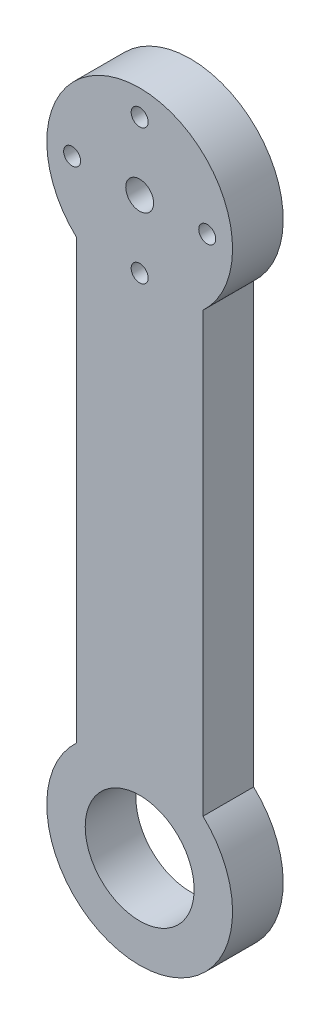
ISO-10303-21;
HEADER;
FILE_DESCRIPTION(('STEP AP214'),'2;1');
FILE_NAME('part.step','',(''),(''),'','','');
FILE_SCHEMA(('AUTOMOTIVE_DESIGN { 1 0 10303 214 1 1 1 1 }'));
ENDSEC;
DATA;
#1=APPLICATION_CONTEXT('core data for automotive mechanical design processes');
#2=APPLICATION_PROTOCOL_DEFINITION('international standard','automotive_design',2000,#1);
#3=PRODUCT_CONTEXT('',#1,'mechanical');
#4=PRODUCT('Part','Part','',(#3));
#5=PRODUCT_RELATED_PRODUCT_CATEGORY('part','',(#4));
#6=PRODUCT_DEFINITION_FORMATION('','',#4);
#7=PRODUCT_DEFINITION_CONTEXT('part definition',#1,'design');
#8=PRODUCT_DEFINITION('design','',#6,#7);
#9=PRODUCT_DEFINITION_SHAPE('','',#8);
#10=(LENGTH_UNIT() NAMED_UNIT(*) SI_UNIT(.MILLI.,.METRE.));
#11=(NAMED_UNIT(*) PLANE_ANGLE_UNIT() SI_UNIT($,.RADIAN.));
#12=(NAMED_UNIT(*) SI_UNIT($,.STERADIAN.) SOLID_ANGLE_UNIT());
#13=UNCERTAINTY_MEASURE_WITH_UNIT(LENGTH_MEASURE(1.E-05),#10,'distance_accuracy_value','');
#14=(GEOMETRIC_REPRESENTATION_CONTEXT(3) GLOBAL_UNCERTAINTY_ASSIGNED_CONTEXT((#13)) GLOBAL_UNIT_ASSIGNED_CONTEXT((#10,
#11,#12)) REPRESENTATION_CONTEXT('',''));
#15=CARTESIAN_POINT('',(0.,0.,0.));
#16=DIRECTION('',(0.,0.,1.));
#17=DIRECTION('',(1.,0.,0.));
#18=AXIS2_PLACEMENT_3D('',#15,#16,#17);
#19=CARTESIAN_POINT('',(7.5,67.5,10.));
#20=DIRECTION('',(0.,0.,-1.));
#21=DIRECTION('',(-1.,0.,0.));
#22=AXIS2_PLACEMENT_3D('',#19,#20,#21);
#23=CYLINDRICAL_SURFACE('',#22,1.005);
#24=CARTESIAN_POINT('',(7.5,67.5,6.));
#25=DIRECTION('',(0.,0.,-1.));
#26=DIRECTION('',(-1.,0.,0.));
#27=AXIS2_PLACEMENT_3D('',#24,#25,#26);
#28=CIRCLE('',#27,1.005);
#29=CARTESIAN_POINT('',(6.495,67.5,6.));
#30=VERTEX_POINT('',#29);
#31=EDGE_CURVE('E160',#30,#30,#28,.T.);
#32=ORIENTED_EDGE('',*,*,#31,.F.);
#33=EDGE_LOOP('',(#32));
#34=FACE_BOUND('',#33,.T.);
#35=CARTESIAN_POINT('',(7.5,67.5,3.));
#36=DIRECTION('',(0.,0.,-1.));
#37=DIRECTION('',(-1.,0.,0.));
#38=AXIS2_PLACEMENT_3D('',#35,#36,#37);
#39=CIRCLE('',#38,1.005);
#40=CARTESIAN_POINT('',(6.495,67.5,3.));
#41=VERTEX_POINT('',#40);
#42=EDGE_CURVE('E39',#41,#41,#39,.F.);
#43=ORIENTED_EDGE('',*,*,#42,.F.);
#44=EDGE_LOOP('',(#43));
#45=FACE_BOUND('',#44,.T.);
#46=ADVANCED_FACE('F35',(#34,#45),#23,.F.);
#47=CARTESIAN_POINT('',(-0.5,75.5,10.));
#48=DIRECTION('',(0.,0.,-1.));
#49=DIRECTION('',(-1.,0.,0.));
#50=AXIS2_PLACEMENT_3D('',#47,#48,#49);
#51=CYLINDRICAL_SURFACE('',#50,1.00499999999999);
#52=CARTESIAN_POINT('',(-0.5,75.5,6.));
#53=DIRECTION('',(0.,0.,-1.));
#54=DIRECTION('',(-1.,0.,0.));
#55=AXIS2_PLACEMENT_3D('',#52,#53,#54);
#56=CIRCLE('',#55,1.00499999999999);
#57=CARTESIAN_POINT('',(-1.50499999999999,75.5,6.));
#58=VERTEX_POINT('',#57);
#59=EDGE_CURVE('E151',#58,#58,#56,.T.);
#60=ORIENTED_EDGE('',*,*,#59,.F.);
#61=EDGE_LOOP('',(#60));
#62=FACE_BOUND('',#61,.T.);
#63=CARTESIAN_POINT('',(-0.5,75.5,3.));
#64=DIRECTION('',(0.,0.,-1.));
#65=DIRECTION('',(-1.,0.,0.));
#66=AXIS2_PLACEMENT_3D('',#63,#64,#65);
#67=CIRCLE('',#66,1.00499999999999);
#68=CARTESIAN_POINT('',(-1.50499999999999,75.5,3.));
#69=VERTEX_POINT('',#68);
#70=EDGE_CURVE('E117',#69,#69,#67,.F.);
#71=ORIENTED_EDGE('',*,*,#70,.F.);
#72=EDGE_LOOP('',(#71));
#73=FACE_BOUND('',#72,.T.);
#74=ADVANCED_FACE('F189',(#62,#73),#51,.F.);
#75=CARTESIAN_POINT('',(7.5,83.5,10.));
#76=DIRECTION('',(0.,0.,-1.));
#77=DIRECTION('',(-1.,0.,0.));
#78=AXIS2_PLACEMENT_3D('',#75,#76,#77);
#79=CYLINDRICAL_SURFACE('',#78,1.00500000000002);
#80=CARTESIAN_POINT('',(7.5,83.5,6.));
#81=DIRECTION('',(0.,0.,-1.));
#82=DIRECTION('',(-1.,0.,0.));
#83=AXIS2_PLACEMENT_3D('',#80,#81,#82);
#84=CIRCLE('',#83,1.00500000000002);
#85=CARTESIAN_POINT('',(6.49499999999998,83.5,6.));
#86=VERTEX_POINT('',#85);
#87=EDGE_CURVE('E154',#86,#86,#84,.T.);
#88=ORIENTED_EDGE('',*,*,#87,.F.);
#89=EDGE_LOOP('',(#88));
#90=FACE_BOUND('',#89,.T.);
#91=CARTESIAN_POINT('',(7.5,83.5,3.));
#92=DIRECTION('',(0.,0.,-1.));
#93=DIRECTION('',(-1.,0.,0.));
#94=AXIS2_PLACEMENT_3D('',#91,#92,#93);
#95=CIRCLE('',#94,1.00500000000002);
#96=CARTESIAN_POINT('',(6.49499999999998,83.5,3.));
#97=VERTEX_POINT('',#96);
#98=EDGE_CURVE('E113',#97,#97,#95,.F.);
#99=ORIENTED_EDGE('',*,*,#98,.F.);
#100=EDGE_LOOP('',(#99));
#101=FACE_BOUND('',#100,.T.);
#102=ADVANCED_FACE('F195',(#90,#101),#79,.F.);
#103=CARTESIAN_POINT('',(15.5,75.5,10.));
#104=DIRECTION('',(0.,0.,-1.));
#105=DIRECTION('',(-1.,0.,0.));
#106=AXIS2_PLACEMENT_3D('',#103,#104,#105);
#107=CYLINDRICAL_SURFACE('',#106,1.005);
#108=CARTESIAN_POINT('',(15.5,75.5,6.));
#109=DIRECTION('',(0.,0.,-1.));
#110=DIRECTION('',(-1.,0.,0.));
#111=AXIS2_PLACEMENT_3D('',#108,#109,#110);
#112=CIRCLE('',#111,1.005);
#113=CARTESIAN_POINT('',(14.495,75.5,6.));
#114=VERTEX_POINT('',#113);
#115=EDGE_CURVE('E157',#114,#114,#112,.T.);
#116=ORIENTED_EDGE('',*,*,#115,.F.);
#117=EDGE_LOOP('',(#116));
#118=FACE_BOUND('',#117,.T.);
#119=CARTESIAN_POINT('',(15.5,75.5,3.));
#120=DIRECTION('',(0.,0.,-1.));
#121=DIRECTION('',(-1.,0.,0.));
#122=AXIS2_PLACEMENT_3D('',#119,#120,#121);
#123=CIRCLE('',#122,1.005);
#124=CARTESIAN_POINT('',(14.495,75.5,3.));
#125=VERTEX_POINT('',#124);
#126=EDGE_CURVE('E108',#125,#125,#123,.F.);
#127=ORIENTED_EDGE('',*,*,#126,.F.);
#128=EDGE_LOOP('',(#127));
#129=FACE_BOUND('',#128,.T.);
#130=ADVANCED_FACE('F202',(#118,#129),#107,.F.);
#131=CARTESIAN_POINT('',(7.5,75.5,10.));
#132=DIRECTION('',(0.,0.,-1.));
#133=DIRECTION('',(-1.,0.,0.));
#134=AXIS2_PLACEMENT_3D('',#131,#132,#133);
#135=CYLINDRICAL_SURFACE('',#134,1.65);
#136=CARTESIAN_POINT('',(7.5,75.5,6.));
#137=DIRECTION('',(0.,0.,-1.));
#138=DIRECTION('',(-1.,0.,0.));
#139=AXIS2_PLACEMENT_3D('',#136,#137,#138);
#140=CIRCLE('',#139,1.65);
#141=CARTESIAN_POINT('',(5.85,75.5,6.));
#142=VERTEX_POINT('',#141);
#143=EDGE_CURVE('E163',#142,#142,#140,.T.);
#144=ORIENTED_EDGE('',*,*,#143,.F.);
#145=EDGE_LOOP('',(#144));
#146=FACE_BOUND('',#145,.T.);
#147=CARTESIAN_POINT('',(7.5,75.5,3.));
#148=DIRECTION('',(0.,0.,-1.));
#149=DIRECTION('',(-1.,0.,0.));
#150=AXIS2_PLACEMENT_3D('',#147,#148,#149);
#151=CIRCLE('',#150,1.65);
#152=CARTESIAN_POINT('',(5.85,75.5,3.));
#153=VERTEX_POINT('',#152);
#154=EDGE_CURVE('E103',#153,#153,#151,.F.);
#155=ORIENTED_EDGE('',*,*,#154,.F.);
#156=EDGE_LOOP('',(#155));
#157=FACE_BOUND('',#156,.T.);
#158=ADVANCED_FACE('F204',(#146,#157),#135,.F.);
#159=CARTESIAN_POINT('',(0.,0.,6.));
#160=DIRECTION('',(1.,0.,0.));
#161=DIRECTION('',(0.,0.,-1.));
#162=AXIS2_PLACEMENT_3D('',#159,#160,#161);
#163=PLANE('',#162);
#164=DIRECTION('',(0.,-1.,0.));
#165=VECTOR('',#164,1.);
#166=CARTESIAN_POINT('',(0.,0.,6.));
#167=LINE('',#166,#165);
#168=CARTESIAN_POINT('',(0.,67.4532615302845,6.));
#169=VERTEX_POINT('',#168);
#170=CARTESIAN_POINT('',(0.,15.5467384697156,6.));
#171=VERTEX_POINT('',#170);
#172=EDGE_CURVE('E44',#169,#171,#167,.T.);
#173=ORIENTED_EDGE('',*,*,#172,.F.);
#174=DIRECTION('',(0.,0.,1.));
#175=VECTOR('',#174,1.);
#176=CARTESIAN_POINT('',(0.,67.4532615302845,0.));
#177=LINE('',#176,#175);
#178=CARTESIAN_POINT('',(0.,67.4532615302845,0.));
#179=VERTEX_POINT('',#178);
#180=EDGE_CURVE('E78',#169,#179,#177,.F.);
#181=ORIENTED_EDGE('',*,*,#180,.T.);
#182=DIRECTION('',(0.,-1.,0.));
#183=VECTOR('',#182,1.);
#184=CARTESIAN_POINT('',(0.,0.,0.));
#185=LINE('',#184,#183);
#186=CARTESIAN_POINT('',(0.,15.5467384697156,0.));
#187=VERTEX_POINT('',#186);
#188=EDGE_CURVE('E89',#179,#187,#185,.T.);
#189=ORIENTED_EDGE('',*,*,#188,.T.);
#190=DIRECTION('',(0.,0.,1.));
#191=VECTOR('',#190,1.);
#192=CARTESIAN_POINT('',(0.,15.5467384697156,0.));
#193=LINE('',#192,#191);
#194=EDGE_CURVE('E96',#187,#171,#193,.T.);
#195=ORIENTED_EDGE('',*,*,#194,.T.);
#196=EDGE_LOOP('',(#173,#181,#189,#195));
#197=FACE_BOUND('',#196,.T.);
#198=ADVANCED_FACE('F37',(#197),#163,.F.);
#199=CARTESIAN_POINT('',(15.,0.,6.));
#200=DIRECTION('',(-1.,0.,0.));
#201=DIRECTION('',(0.,0.,1.));
#202=AXIS2_PLACEMENT_3D('',#199,#200,#201);
#203=PLANE('',#202);
#204=DIRECTION('',(0.,1.,0.));
#205=VECTOR('',#204,1.);
#206=CARTESIAN_POINT('',(15.,0.,0.));
#207=LINE('',#206,#205);
#208=CARTESIAN_POINT('',(15.,15.5467384697156,0.));
#209=VERTEX_POINT('',#208);
#210=CARTESIAN_POINT('',(15.,67.4532615302845,0.));
#211=VERTEX_POINT('',#210);
#212=EDGE_CURVE('E95',#209,#211,#207,.T.);
#213=ORIENTED_EDGE('',*,*,#212,.T.);
#214=DIRECTION('',(0.,0.,1.));
#215=VECTOR('',#214,1.);
#216=CARTESIAN_POINT('',(15.,67.4532615302845,0.));
#217=LINE('',#216,#215);
#218=CARTESIAN_POINT('',(15.,67.4532615302845,6.));
#219=VERTEX_POINT('',#218);
#220=EDGE_CURVE('E80',#211,#219,#217,.T.);
#221=ORIENTED_EDGE('',*,*,#220,.T.);
#222=DIRECTION('',(0.,1.,0.));
#223=VECTOR('',#222,1.);
#224=CARTESIAN_POINT('',(15.,0.,6.));
#225=LINE('',#224,#223);
#226=CARTESIAN_POINT('',(15.,15.5467384697156,6.));
#227=VERTEX_POINT('',#226);
#228=EDGE_CURVE('E11',#227,#219,#225,.T.);
#229=ORIENTED_EDGE('',*,*,#228,.F.);
#230=DIRECTION('',(0.,0.,1.));
#231=VECTOR('',#230,1.);
#232=CARTESIAN_POINT('',(15.,15.5467384697156,0.));
#233=LINE('',#232,#231);
#234=EDGE_CURVE('E99',#227,#209,#233,.F.);
#235=ORIENTED_EDGE('',*,*,#234,.T.);
#236=EDGE_LOOP('',(#213,#221,#229,#235));
#237=FACE_BOUND('',#236,.T.);
#238=ADVANCED_FACE('F173',(#237),#203,.F.);
#239=CARTESIAN_POINT('',(0.,0.,6.));
#240=DIRECTION('',(0.,0.,-1.));
#241=DIRECTION('',(-1.,0.,0.));
#242=AXIS2_PLACEMENT_3D('',#239,#240,#241);
#243=PLANE('',#242);
#244=CARTESIAN_POINT('',(7.5,7.5,6.));
#245=DIRECTION('',(0.,0.,-1.));
#246=DIRECTION('',(-1.,0.,0.));
#247=AXIS2_PLACEMENT_3D('',#244,#245,#246);
#248=CIRCLE('',#247,6.45);
#249=CARTESIAN_POINT('',(1.05,7.5,6.));
#250=VERTEX_POINT('',#249);
#251=EDGE_CURVE('E148',#250,#250,#248,.T.);
#252=ORIENTED_EDGE('',*,*,#251,.T.);
#253=EDGE_LOOP('',(#252));
#254=FACE_BOUND('',#253,.T.);
#255=ORIENTED_EDGE('',*,*,#59,.T.);
#256=EDGE_LOOP('',(#255));
#257=FACE_BOUND('',#256,.T.);
#258=ORIENTED_EDGE('',*,*,#87,.T.);
#259=EDGE_LOOP('',(#258));
#260=FACE_BOUND('',#259,.T.);
#261=ORIENTED_EDGE('',*,*,#115,.T.);
#262=EDGE_LOOP('',(#261));
#263=FACE_BOUND('',#262,.T.);
#264=ORIENTED_EDGE('',*,*,#31,.T.);
#265=EDGE_LOOP('',(#264));
#266=FACE_BOUND('',#265,.T.);
#267=ORIENTED_EDGE('',*,*,#143,.T.);
#268=EDGE_LOOP('',(#267));
#269=FACE_BOUND('',#268,.T.);
#270=CARTESIAN_POINT('',(7.5,75.5,6.));
#271=DIRECTION('',(0.,0.,1.));
#272=DIRECTION('',(1.,0.,0.));
#273=AXIS2_PLACEMENT_3D('',#270,#271,#272);
#274=CIRCLE('',#273,11.);
#275=EDGE_CURVE('E85',#219,#169,#274,.T.);
#276=ORIENTED_EDGE('',*,*,#275,.T.);
#277=ORIENTED_EDGE('',*,*,#172,.T.);
#278=CARTESIAN_POINT('',(7.5,7.5,6.));
#279=DIRECTION('',(0.,0.,1.));
#280=DIRECTION('',(1.,0.,0.));
#281=AXIS2_PLACEMENT_3D('',#278,#279,#280);
#282=CIRCLE('',#281,11.);
#283=EDGE_CURVE('E51',#171,#227,#282,.T.);
#284=ORIENTED_EDGE('',*,*,#283,.T.);
#285=ORIENTED_EDGE('',*,*,#228,.T.);
#286=EDGE_LOOP('',(#276,#277,#284,#285));
#287=FACE_BOUND('',#286,.T.);
#288=ADVANCED_FACE('F184',(#254,#257,#260,#263,#266,#269,#287),#243,.F.);
#289=CARTESIAN_POINT('',(0.,0.,0.));
#290=DIRECTION('',(0.,0.,-1.));
#291=DIRECTION('',(-1.,0.,0.));
#292=AXIS2_PLACEMENT_3D('',#289,#290,#291);
#293=PLANE('',#292);
#294=CARTESIAN_POINT('',(7.5,67.5,0.));
#295=DIRECTION('',(0.,0.,-1.));
#296=DIRECTION('',(-1.,0.,0.));
#297=AXIS2_PLACEMENT_3D('',#294,#295,#296);
#298=CIRCLE('',#297,2.00000000000001);
#299=CARTESIAN_POINT('',(5.49999999999999,67.5,0.));
#300=VERTEX_POINT('',#299);
#301=EDGE_CURVE('E133',#300,#300,#298,.T.);
#302=ORIENTED_EDGE('',*,*,#301,.F.);
#303=EDGE_LOOP('',(#302));
#304=FACE_BOUND('',#303,.T.);
#305=CARTESIAN_POINT('',(-0.5,75.5,0.));
#306=DIRECTION('',(0.,0.,-1.));
#307=DIRECTION('',(-1.,0.,0.));
#308=AXIS2_PLACEMENT_3D('',#305,#306,#307);
#309=CIRCLE('',#308,2.00000000000001);
#310=CARTESIAN_POINT('',(-2.50000000000001,75.5,0.));
#311=VERTEX_POINT('',#310);
#312=EDGE_CURVE('E126',#311,#311,#309,.T.);
#313=ORIENTED_EDGE('',*,*,#312,.F.);
#314=EDGE_LOOP('',(#313));
#315=FACE_BOUND('',#314,.T.);
#316=CARTESIAN_POINT('',(7.5,83.5,0.));
#317=DIRECTION('',(0.,0.,-1.));
#318=DIRECTION('',(-1.,0.,0.));
#319=AXIS2_PLACEMENT_3D('',#316,#317,#318);
#320=CIRCLE('',#319,2.);
#321=CARTESIAN_POINT('',(5.5,83.5,0.));
#322=VERTEX_POINT('',#321);
#323=EDGE_CURVE('E119',#322,#322,#320,.T.);
#324=ORIENTED_EDGE('',*,*,#323,.F.);
#325=EDGE_LOOP('',(#324));
#326=FACE_BOUND('',#325,.T.);
#327=CARTESIAN_POINT('',(15.5,75.5,0.));
#328=DIRECTION('',(0.,0.,-1.));
#329=DIRECTION('',(-1.,0.,0.));
#330=AXIS2_PLACEMENT_3D('',#327,#328,#329);
#331=CIRCLE('',#330,2.);
#332=CARTESIAN_POINT('',(13.5,75.5,0.));
#333=VERTEX_POINT('',#332);
#334=EDGE_CURVE('E115',#333,#333,#331,.T.);
#335=ORIENTED_EDGE('',*,*,#334,.F.);
#336=EDGE_LOOP('',(#335));
#337=FACE_BOUND('',#336,.T.);
#338=CARTESIAN_POINT('',(7.5,75.5,0.));
#339=DIRECTION('',(0.,0.,-1.));
#340=DIRECTION('',(-1.,0.,0.));
#341=AXIS2_PLACEMENT_3D('',#338,#339,#340);
#342=CIRCLE('',#341,3.);
#343=CARTESIAN_POINT('',(4.5,75.5,0.));
#344=VERTEX_POINT('',#343);
#345=EDGE_CURVE('E111',#344,#344,#342,.T.);
#346=ORIENTED_EDGE('',*,*,#345,.F.);
#347=EDGE_LOOP('',(#346));
#348=FACE_BOUND('',#347,.T.);
#349=CARTESIAN_POINT('',(7.5,7.5,0.));
#350=DIRECTION('',(0.,0.,-1.));
#351=DIRECTION('',(-1.,0.,0.));
#352=AXIS2_PLACEMENT_3D('',#349,#350,#351);
#353=CIRCLE('',#352,6.45);
#354=CARTESIAN_POINT('',(1.05,7.5,0.));
#355=VERTEX_POINT('',#354);
#356=EDGE_CURVE('E106',#355,#355,#353,.T.);
#357=ORIENTED_EDGE('',*,*,#356,.F.);
#358=EDGE_LOOP('',(#357));
#359=FACE_BOUND('',#358,.T.);
#360=ORIENTED_EDGE('',*,*,#188,.F.);
#361=CARTESIAN_POINT('',(7.5,75.5,0.));
#362=DIRECTION('',(0.,0.,1.));
#363=DIRECTION('',(1.,0.,0.));
#364=AXIS2_PLACEMENT_3D('',#361,#362,#363);
#365=CIRCLE('',#364,11.);
#366=EDGE_CURVE('E75',#211,#179,#365,.T.);
#367=ORIENTED_EDGE('',*,*,#366,.F.);
#368=ORIENTED_EDGE('',*,*,#212,.F.);
#369=CARTESIAN_POINT('',(7.5,7.5,0.));
#370=DIRECTION('',(0.,0.,1.));
#371=DIRECTION('',(1.,0.,0.));
#372=AXIS2_PLACEMENT_3D('',#369,#370,#371);
#373=CIRCLE('',#372,11.);
#374=EDGE_CURVE('E94',#187,#209,#373,.T.);
#375=ORIENTED_EDGE('',*,*,#374,.F.);
#376=EDGE_LOOP('',(#360,#367,#368,#375));
#377=FACE_BOUND('',#376,.T.);
#378=ADVANCED_FACE('F93',(#304,#315,#326,#337,#348,#359,#377),#293,.T.);
#379=CARTESIAN_POINT('',(7.5,7.5,0.));
#380=DIRECTION('',(0.,0.,1.));
#381=DIRECTION('',(1.,0.,0.));
#382=AXIS2_PLACEMENT_3D('',#379,#380,#381);
#383=CYLINDRICAL_SURFACE('',#382,11.);
#384=ORIENTED_EDGE('',*,*,#194,.F.);
#385=ORIENTED_EDGE('',*,*,#374,.T.);
#386=ORIENTED_EDGE('',*,*,#234,.F.);
#387=ORIENTED_EDGE('',*,*,#283,.F.);
#388=EDGE_LOOP('',(#384,#385,#386,#387));
#389=FACE_BOUND('',#388,.T.);
#390=ADVANCED_FACE('F175',(#389),#383,.T.);
#391=CARTESIAN_POINT('',(7.5,75.5,0.));
#392=DIRECTION('',(0.,0.,1.));
#393=DIRECTION('',(1.,0.,0.));
#394=AXIS2_PLACEMENT_3D('',#391,#392,#393);
#395=CYLINDRICAL_SURFACE('',#394,11.);
#396=ORIENTED_EDGE('',*,*,#180,.F.);
#397=ORIENTED_EDGE('',*,*,#275,.F.);
#398=ORIENTED_EDGE('',*,*,#220,.F.);
#399=ORIENTED_EDGE('',*,*,#366,.T.);
#400=EDGE_LOOP('',(#396,#397,#398,#399));
#401=FACE_BOUND('',#400,.T.);
#402=ADVANCED_FACE('F77',(#401),#395,.T.);
#403=CARTESIAN_POINT('',(7.5,7.5,10.));
#404=DIRECTION('',(0.,0.,-1.));
#405=DIRECTION('',(-1.,0.,0.));
#406=AXIS2_PLACEMENT_3D('',#403,#404,#405);
#407=CYLINDRICAL_SURFACE('',#406,6.45);
#408=ORIENTED_EDGE('',*,*,#356,.T.);
#409=EDGE_LOOP('',(#408));
#410=FACE_BOUND('',#409,.T.);
#411=ORIENTED_EDGE('',*,*,#251,.F.);
#412=EDGE_LOOP('',(#411));
#413=FACE_BOUND('',#412,.T.);
#414=ADVANCED_FACE('F182',(#410,#413),#407,.F.);
#415=CARTESIAN_POINT('',(7.5,75.5,3.));
#416=DIRECTION('',(0.,0.,-1.));
#417=DIRECTION('',(-1.,0.,0.));
#418=AXIS2_PLACEMENT_3D('',#415,#416,#417);
#419=PLANE('',#418);
#420=CARTESIAN_POINT('',(7.5,75.5,3.));
#421=DIRECTION('',(0.,0.,-1.));
#422=DIRECTION('',(-1.,0.,0.));
#423=AXIS2_PLACEMENT_3D('',#420,#421,#422);
#424=CIRCLE('',#423,3.);
#425=CARTESIAN_POINT('',(4.5,75.5,3.));
#426=VERTEX_POINT('',#425);
#427=EDGE_CURVE('E107',#426,#426,#424,.T.);
#428=ORIENTED_EDGE('',*,*,#427,.T.);
#429=EDGE_LOOP('',(#428));
#430=FACE_BOUND('',#429,.T.);
#431=ORIENTED_EDGE('',*,*,#154,.T.);
#432=EDGE_LOOP('',(#431));
#433=FACE_BOUND('',#432,.T.);
#434=ADVANCED_FACE('F216',(#430,#433),#419,.T.);
#435=CARTESIAN_POINT('',(7.5,75.5,3.));
#436=DIRECTION('',(0.,0.,-1.));
#437=DIRECTION('',(-1.,0.,0.));
#438=AXIS2_PLACEMENT_3D('',#435,#436,#437);
#439=CYLINDRICAL_SURFACE('',#438,3.);
#440=ORIENTED_EDGE('',*,*,#427,.F.);
#441=EDGE_LOOP('',(#440));
#442=FACE_BOUND('',#441,.T.);
#443=ORIENTED_EDGE('',*,*,#345,.T.);
#444=EDGE_LOOP('',(#443));
#445=FACE_BOUND('',#444,.T.);
#446=ADVANCED_FACE('F218',(#442,#445),#439,.F.);
#447=CARTESIAN_POINT('',(15.5,75.5,3.));
#448=DIRECTION('',(0.,0.,-1.));
#449=DIRECTION('',(-1.,0.,0.));
#450=AXIS2_PLACEMENT_3D('',#447,#448,#449);
#451=PLANE('',#450);
#452=CARTESIAN_POINT('',(15.5,75.5,3.));
#453=DIRECTION('',(0.,0.,-1.));
#454=DIRECTION('',(-1.,0.,0.));
#455=AXIS2_PLACEMENT_3D('',#452,#453,#454);
#456=CIRCLE('',#455,2.);
#457=CARTESIAN_POINT('',(13.5,75.5,3.));
#458=VERTEX_POINT('',#457);
#459=EDGE_CURVE('E112',#458,#458,#456,.T.);
#460=ORIENTED_EDGE('',*,*,#459,.T.);
#461=EDGE_LOOP('',(#460));
#462=FACE_BOUND('',#461,.T.);
#463=ORIENTED_EDGE('',*,*,#126,.T.);
#464=EDGE_LOOP('',(#463));
#465=FACE_BOUND('',#464,.T.);
#466=ADVANCED_FACE('F225',(#462,#465),#451,.T.);
#467=CARTESIAN_POINT('',(15.5,75.5,3.));
#468=DIRECTION('',(0.,0.,-1.));
#469=DIRECTION('',(-1.,0.,0.));
#470=AXIS2_PLACEMENT_3D('',#467,#468,#469);
#471=CYLINDRICAL_SURFACE('',#470,2.);
#472=ORIENTED_EDGE('',*,*,#459,.F.);
#473=EDGE_LOOP('',(#472));
#474=FACE_BOUND('',#473,.T.);
#475=ORIENTED_EDGE('',*,*,#334,.T.);
#476=EDGE_LOOP('',(#475));
#477=FACE_BOUND('',#476,.T.);
#478=ADVANCED_FACE('F231',(#474,#477),#471,.F.);
#479=CARTESIAN_POINT('',(7.5,83.5,3.));
#480=DIRECTION('',(0.,0.,-1.));
#481=DIRECTION('',(-1.,0.,0.));
#482=AXIS2_PLACEMENT_3D('',#479,#480,#481);
#483=PLANE('',#482);
#484=CARTESIAN_POINT('',(7.5,83.5,3.));
#485=DIRECTION('',(0.,0.,-1.));
#486=DIRECTION('',(-1.,0.,0.));
#487=AXIS2_PLACEMENT_3D('',#484,#485,#486);
#488=CIRCLE('',#487,2.);
#489=CARTESIAN_POINT('',(5.5,83.5,3.));
#490=VERTEX_POINT('',#489);
#491=EDGE_CURVE('E116',#490,#490,#488,.T.);
#492=ORIENTED_EDGE('',*,*,#491,.T.);
#493=EDGE_LOOP('',(#492));
#494=FACE_BOUND('',#493,.T.);
#495=ORIENTED_EDGE('',*,*,#98,.T.);
#496=EDGE_LOOP('',(#495));
#497=FACE_BOUND('',#496,.T.);
#498=ADVANCED_FACE('F241',(#494,#497),#483,.T.);
#499=CARTESIAN_POINT('',(7.5,83.5,3.));
#500=DIRECTION('',(0.,0.,-1.));
#501=DIRECTION('',(-1.,0.,0.));
#502=AXIS2_PLACEMENT_3D('',#499,#500,#501);
#503=CYLINDRICAL_SURFACE('',#502,2.);
#504=ORIENTED_EDGE('',*,*,#491,.F.);
#505=EDGE_LOOP('',(#504));
#506=FACE_BOUND('',#505,.T.);
#507=ORIENTED_EDGE('',*,*,#323,.T.);
#508=EDGE_LOOP('',(#507));
#509=FACE_BOUND('',#508,.T.);
#510=ADVANCED_FACE('F243',(#506,#509),#503,.F.);
#511=CARTESIAN_POINT('',(-0.5,75.5,3.));
#512=DIRECTION('',(0.,0.,-1.));
#513=DIRECTION('',(-1.,0.,0.));
#514=AXIS2_PLACEMENT_3D('',#511,#512,#513);
#515=PLANE('',#514);
#516=CARTESIAN_POINT('',(-0.5,75.5,3.));
#517=DIRECTION('',(0.,0.,-1.));
#518=DIRECTION('',(-1.,0.,0.));
#519=AXIS2_PLACEMENT_3D('',#516,#517,#518);
#520=CIRCLE('',#519,2.00000000000001);
#521=CARTESIAN_POINT('',(-2.50000000000001,75.5,3.));
#522=VERTEX_POINT('',#521);
#523=EDGE_CURVE('E120',#522,#522,#520,.T.);
#524=ORIENTED_EDGE('',*,*,#523,.T.);
#525=EDGE_LOOP('',(#524));
#526=FACE_BOUND('',#525,.T.);
#527=ORIENTED_EDGE('',*,*,#70,.T.);
#528=EDGE_LOOP('',(#527));
#529=FACE_BOUND('',#528,.T.);
#530=ADVANCED_FACE('F250',(#526,#529),#515,.T.);
#531=CARTESIAN_POINT('',(-0.5,75.5,3.));
#532=DIRECTION('',(0.,0.,-1.));
#533=DIRECTION('',(-1.,0.,0.));
#534=AXIS2_PLACEMENT_3D('',#531,#532,#533);
#535=CYLINDRICAL_SURFACE('',#534,2.00000000000001);
#536=ORIENTED_EDGE('',*,*,#523,.F.);
#537=EDGE_LOOP('',(#536));
#538=FACE_BOUND('',#537,.T.);
#539=ORIENTED_EDGE('',*,*,#312,.T.);
#540=EDGE_LOOP('',(#539));
#541=FACE_BOUND('',#540,.T.);
#542=ADVANCED_FACE('F255',(#538,#541),#535,.F.);
#543=CARTESIAN_POINT('',(7.5,67.5,3.));
#544=DIRECTION('',(0.,0.,-1.));
#545=DIRECTION('',(-1.,0.,0.));
#546=AXIS2_PLACEMENT_3D('',#543,#544,#545);
#547=PLANE('',#546);
#548=CARTESIAN_POINT('',(7.5,67.5,3.));
#549=DIRECTION('',(0.,0.,-1.));
#550=DIRECTION('',(-1.,0.,0.));
#551=AXIS2_PLACEMENT_3D('',#548,#549,#550);
#552=CIRCLE('',#551,2.00000000000001);
#553=CARTESIAN_POINT('',(5.49999999999999,67.5,3.));
#554=VERTEX_POINT('',#553);
#555=EDGE_CURVE('E423',#554,#554,#552,.T.);
#556=ORIENTED_EDGE('',*,*,#555,.T.);
#557=EDGE_LOOP('',(#556));
#558=FACE_BOUND('',#557,.T.);
#559=ORIENTED_EDGE('',*,*,#42,.T.);
#560=EDGE_LOOP('',(#559));
#561=FACE_BOUND('',#560,.T.);
#562=ADVANCED_FACE('F397',(#558,#561),#547,.T.);
#563=CARTESIAN_POINT('',(7.5,67.5,3.));
#564=DIRECTION('',(0.,0.,-1.));
#565=DIRECTION('',(-1.,0.,0.));
#566=AXIS2_PLACEMENT_3D('',#563,#564,#565);
#567=CYLINDRICAL_SURFACE('',#566,2.00000000000001);
#568=ORIENTED_EDGE('',*,*,#555,.F.);
#569=EDGE_LOOP('',(#568));
#570=FACE_BOUND('',#569,.T.);
#571=ORIENTED_EDGE('',*,*,#301,.T.);
#572=EDGE_LOOP('',(#571));
#573=FACE_BOUND('',#572,.T.);
#574=ADVANCED_FACE('F406',(#570,#573),#567,.F.);
#575=CLOSED_SHELL('',(#46,#74,#102,#130,#158,#198,#238,#288,#378,#390,#402,#414,#434,#446,#466,
#478,#498,#510,#530,#542,#562,#574));
#576=MANIFOLD_SOLID_BREP('B2',#575);
#577=ADVANCED_BREP_SHAPE_REPRESENTATION('',(#18,#576),#14);
#578=SHAPE_DEFINITION_REPRESENTATION(#9,#577);
ENDSEC;
END-ISO-10303-21;
